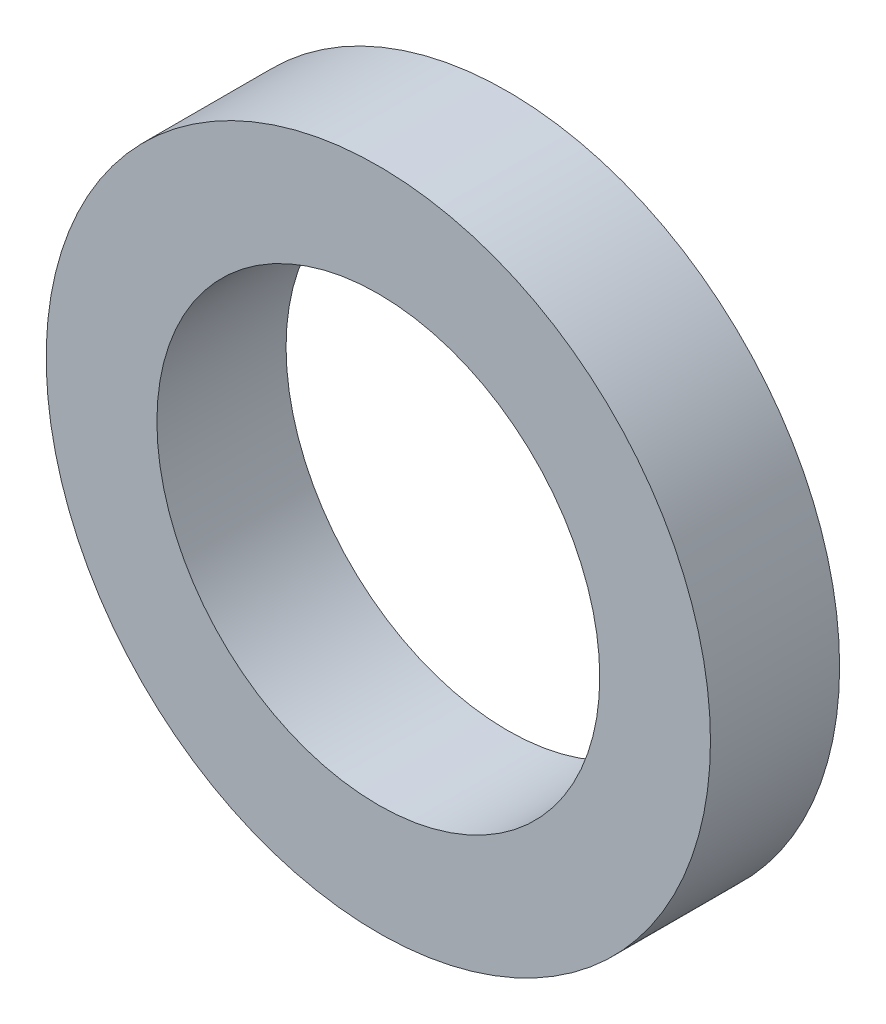
ISO-10303-21;
HEADER;
FILE_DESCRIPTION(('STEP AP214'),'2;1');
FILE_NAME('part.step','',(''),(''),'','','');
FILE_SCHEMA(('AUTOMOTIVE_DESIGN { 1 0 10303 214 1 1 1 1 }'));
ENDSEC;
DATA;
#1=APPLICATION_CONTEXT('core data for automotive mechanical design processes');
#2=APPLICATION_PROTOCOL_DEFINITION('international standard','automotive_design',2000,#1);
#3=PRODUCT_CONTEXT('',#1,'mechanical');
#4=PRODUCT('Part','Part','',(#3));
#5=PRODUCT_RELATED_PRODUCT_CATEGORY('part','',(#4));
#6=PRODUCT_DEFINITION_FORMATION('','',#4);
#7=PRODUCT_DEFINITION_CONTEXT('part definition',#1,'design');
#8=PRODUCT_DEFINITION('design','',#6,#7);
#9=PRODUCT_DEFINITION_SHAPE('','',#8);
#10=(LENGTH_UNIT() NAMED_UNIT(*) SI_UNIT(.MILLI.,.METRE.));
#11=(NAMED_UNIT(*) PLANE_ANGLE_UNIT() SI_UNIT($,.RADIAN.));
#12=(NAMED_UNIT(*) SI_UNIT($,.STERADIAN.) SOLID_ANGLE_UNIT());
#13=UNCERTAINTY_MEASURE_WITH_UNIT(LENGTH_MEASURE(1.E-05),#10,'distance_accuracy_value','');
#14=(GEOMETRIC_REPRESENTATION_CONTEXT(3) GLOBAL_UNCERTAINTY_ASSIGNED_CONTEXT((#13)) GLOBAL_UNIT_ASSIGNED_CONTEXT((#10,
#11,#12)) REPRESENTATION_CONTEXT('',''));
#15=CARTESIAN_POINT('',(0.,0.,0.));
#16=DIRECTION('',(0.,0.,1.));
#17=DIRECTION('',(1.,0.,0.));
#18=AXIS2_PLACEMENT_3D('',#15,#16,#17);
#19=CARTESIAN_POINT('',(0.,0.,65.));
#20=DIRECTION('',(0.,0.,1.));
#21=DIRECTION('',(1.,0.,0.));
#22=AXIS2_PLACEMENT_3D('',#19,#20,#21);
#23=PLANE('',#22);
#24=CARTESIAN_POINT('',(0.,0.,65.));
#25=DIRECTION('',(0.,0.,1.));
#26=DIRECTION('',(1.,0.,0.));
#27=AXIS2_PLACEMENT_3D('',#24,#25,#26);
#28=CIRCLE('',#27,18.);
#29=CARTESIAN_POINT('',(18.,0.,65.));
#30=VERTEX_POINT('',#29);
#31=EDGE_CURVE('E10',#30,#30,#28,.T.);
#32=ORIENTED_EDGE('',*,*,#31,.T.);
#33=EDGE_LOOP('',(#32));
#34=FACE_BOUND('',#33,.T.);
#35=CARTESIAN_POINT('',(0.,0.,65.));
#36=DIRECTION('',(0.,0.,1.));
#37=DIRECTION('',(1.,0.,0.));
#38=AXIS2_PLACEMENT_3D('',#35,#36,#37);
#39=CIRCLE('',#38,12.);
#40=CARTESIAN_POINT('',(12.,0.,65.));
#41=VERTEX_POINT('',#40);
#42=EDGE_CURVE('E48',#41,#41,#39,.T.);
#43=ORIENTED_EDGE('',*,*,#42,.F.);
#44=EDGE_LOOP('',(#43));
#45=FACE_BOUND('',#44,.T.);
#46=ADVANCED_FACE('F40',(#34,#45),#23,.T.);
#47=CARTESIAN_POINT('',(0.,0.,58.));
#48=DIRECTION('',(0.,0.,1.));
#49=DIRECTION('',(1.,0.,0.));
#50=AXIS2_PLACEMENT_3D('',#47,#48,#49);
#51=PLANE('',#50);
#52=CARTESIAN_POINT('',(0.,0.,58.));
#53=DIRECTION('',(0.,0.,1.));
#54=DIRECTION('',(1.,0.,0.));
#55=AXIS2_PLACEMENT_3D('',#52,#53,#54);
#56=CIRCLE('',#55,18.);
#57=CARTESIAN_POINT('',(18.,0.,58.));
#58=VERTEX_POINT('',#57);
#59=EDGE_CURVE('E41',#58,#58,#56,.T.);
#60=ORIENTED_EDGE('',*,*,#59,.F.);
#61=EDGE_LOOP('',(#60));
#62=FACE_BOUND('',#61,.T.);
#63=CARTESIAN_POINT('',(0.,0.,58.));
#64=DIRECTION('',(0.,0.,1.));
#65=DIRECTION('',(1.,0.,0.));
#66=AXIS2_PLACEMENT_3D('',#63,#64,#65);
#67=CIRCLE('',#66,12.);
#68=CARTESIAN_POINT('',(12.,0.,58.));
#69=VERTEX_POINT('',#68);
#70=EDGE_CURVE('E49',#69,#69,#67,.T.);
#71=ORIENTED_EDGE('',*,*,#70,.T.);
#72=EDGE_LOOP('',(#71));
#73=FACE_BOUND('',#72,.T.);
#74=ADVANCED_FACE('F58',(#62,#73),#51,.F.);
#75=CARTESIAN_POINT('',(0.,0.,65.));
#76=DIRECTION('',(0.,0.,-1.));
#77=DIRECTION('',(-1.,0.,0.));
#78=AXIS2_PLACEMENT_3D('',#75,#76,#77);
#79=CYLINDRICAL_SURFACE('',#78,18.);
#80=ORIENTED_EDGE('',*,*,#31,.F.);
#81=EDGE_LOOP('',(#80));
#82=FACE_BOUND('',#81,.T.);
#83=ORIENTED_EDGE('',*,*,#59,.T.);
#84=EDGE_LOOP('',(#83));
#85=FACE_BOUND('',#84,.T.);
#86=ADVANCED_FACE('F39',(#82,#85),#79,.T.);
#87=CARTESIAN_POINT('',(0.,0.,65.));
#88=DIRECTION('',(0.,0.,-1.));
#89=DIRECTION('',(-1.,0.,0.));
#90=AXIS2_PLACEMENT_3D('',#87,#88,#89);
#91=CYLINDRICAL_SURFACE('',#90,12.);
#92=ORIENTED_EDGE('',*,*,#42,.T.);
#93=EDGE_LOOP('',(#92));
#94=FACE_BOUND('',#93,.T.);
#95=ORIENTED_EDGE('',*,*,#70,.F.);
#96=EDGE_LOOP('',(#95));
#97=FACE_BOUND('',#96,.T.);
#98=ADVANCED_FACE('F57',(#94,#97),#91,.F.);
#99=CLOSED_SHELL('',(#46,#74,#86,#98));
#100=MANIFOLD_SOLID_BREP('B2',#99);
#101=ADVANCED_BREP_SHAPE_REPRESENTATION('',(#18,#100),#14);
#102=SHAPE_DEFINITION_REPRESENTATION(#9,#101);
ENDSEC;
END-ISO-10303-21;
